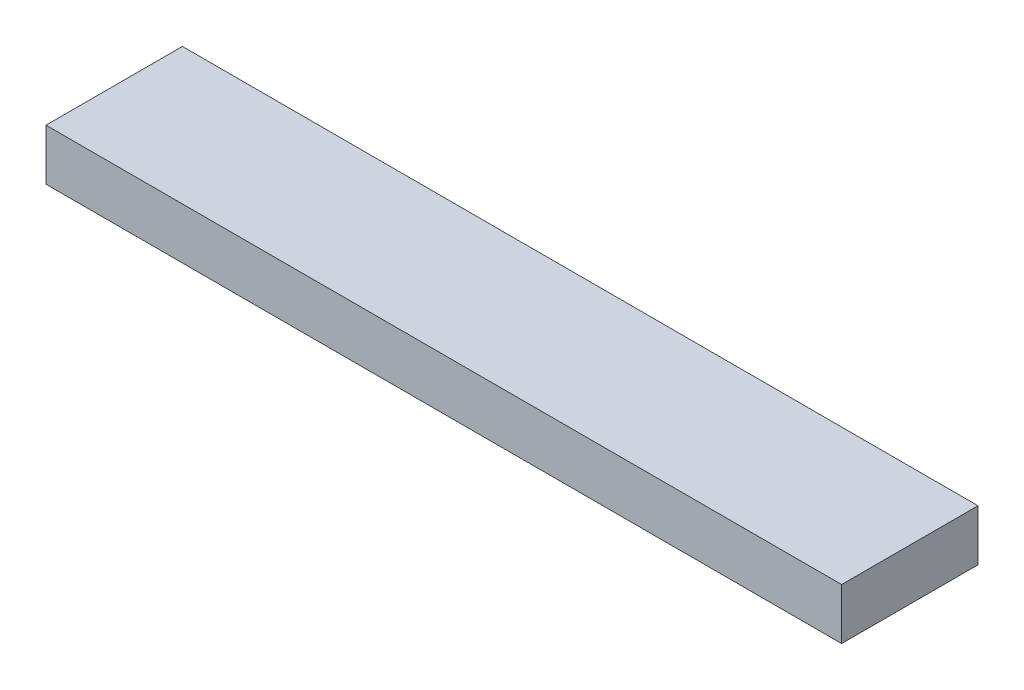
ISO-10303-21;
HEADER;
FILE_DESCRIPTION(('STEP AP214'),'2;1');
FILE_NAME('part.step','',(''),(''),'','','');
FILE_SCHEMA(('AUTOMOTIVE_DESIGN { 1 0 10303 214 1 1 1 1 }'));
ENDSEC;
DATA;
#1=APPLICATION_CONTEXT('core data for automotive mechanical design processes');
#2=APPLICATION_PROTOCOL_DEFINITION('international standard','automotive_design',2000,#1);
#3=PRODUCT_CONTEXT('',#1,'mechanical');
#4=PRODUCT('Part','Part','',(#3));
#5=PRODUCT_RELATED_PRODUCT_CATEGORY('part','',(#4));
#6=PRODUCT_DEFINITION_FORMATION('','',#4);
#7=PRODUCT_DEFINITION_CONTEXT('part definition',#1,'design');
#8=PRODUCT_DEFINITION('design','',#6,#7);
#9=PRODUCT_DEFINITION_SHAPE('','',#8);
#10=(LENGTH_UNIT() NAMED_UNIT(*) SI_UNIT(.MILLI.,.METRE.));
#11=(NAMED_UNIT(*) PLANE_ANGLE_UNIT() SI_UNIT($,.RADIAN.));
#12=(NAMED_UNIT(*) SI_UNIT($,.STERADIAN.) SOLID_ANGLE_UNIT());
#13=UNCERTAINTY_MEASURE_WITH_UNIT(LENGTH_MEASURE(1.E-05),#10,'distance_accuracy_value','');
#14=(GEOMETRIC_REPRESENTATION_CONTEXT(3) GLOBAL_UNCERTAINTY_ASSIGNED_CONTEXT((#13)) GLOBAL_UNIT_ASSIGNED_CONTEXT((#10,
#11,#12)) REPRESENTATION_CONTEXT('',''));
#15=CARTESIAN_POINT('',(0.,0.,0.));
#16=DIRECTION('',(0.,0.,1.));
#17=DIRECTION('',(1.,0.,0.));
#18=AXIS2_PLACEMENT_3D('',#15,#16,#17);
#19=CARTESIAN_POINT('',(0.,4.5,0.));
#20=DIRECTION('',(1.,0.,0.));
#21=DIRECTION('',(0.,0.,-1.));
#22=AXIS2_PLACEMENT_3D('',#19,#20,#21);
#23=PLANE('',#22);
#24=DIRECTION('',(0.,0.,1.));
#25=VECTOR('',#24,1.);
#26=CARTESIAN_POINT('',(0.,0.,0.));
#27=LINE('',#26,#25);
#28=CARTESIAN_POINT('',(0.,0.,-12.));
#29=VERTEX_POINT('',#28);
#30=CARTESIAN_POINT('',(0.,0.,0.));
#31=VERTEX_POINT('',#30);
#32=EDGE_CURVE('E98',#29,#31,#27,.T.);
#33=ORIENTED_EDGE('',*,*,#32,.T.);
#34=DIRECTION('',(0.,-1.,0.));
#35=VECTOR('',#34,1.);
#36=CARTESIAN_POINT('',(0.,4.5,0.));
#37=LINE('',#36,#35);
#38=CARTESIAN_POINT('',(0.,4.5,0.));
#39=VERTEX_POINT('',#38);
#40=EDGE_CURVE('E11',#39,#31,#37,.T.);
#41=ORIENTED_EDGE('',*,*,#40,.F.);
#42=DIRECTION('',(0.,0.,1.));
#43=VECTOR('',#42,1.);
#44=CARTESIAN_POINT('',(0.,4.5,0.));
#45=LINE('',#44,#43);
#46=CARTESIAN_POINT('',(0.,4.5,-12.));
#47=VERTEX_POINT('',#46);
#48=EDGE_CURVE('E86',#47,#39,#45,.T.);
#49=ORIENTED_EDGE('',*,*,#48,.F.);
#50=DIRECTION('',(0.,-1.,0.));
#51=VECTOR('',#50,1.);
#52=CARTESIAN_POINT('',(0.,4.5,-12.));
#53=LINE('',#52,#51);
#54=EDGE_CURVE('E94',#47,#29,#53,.T.);
#55=ORIENTED_EDGE('',*,*,#54,.T.);
#56=EDGE_LOOP('',(#33,#41,#49,#55));
#57=FACE_BOUND('',#56,.T.);
#58=ADVANCED_FACE('F35',(#57),#23,.F.);
#59=CARTESIAN_POINT('',(0.,4.5,0.));
#60=DIRECTION('',(0.,0.,-1.));
#61=DIRECTION('',(-1.,0.,0.));
#62=AXIS2_PLACEMENT_3D('',#59,#60,#61);
#63=PLANE('',#62);
#64=DIRECTION('',(1.,0.,0.));
#65=VECTOR('',#64,1.);
#66=CARTESIAN_POINT('',(0.,0.,0.));
#67=LINE('',#66,#65);
#68=CARTESIAN_POINT('',(70.,0.,0.));
#69=VERTEX_POINT('',#68);
#70=EDGE_CURVE('E90',#31,#69,#67,.T.);
#71=ORIENTED_EDGE('',*,*,#70,.T.);
#72=DIRECTION('',(0.,-1.,0.));
#73=VECTOR('',#72,1.);
#74=CARTESIAN_POINT('',(70.,4.5,0.));
#75=LINE('',#74,#73);
#76=CARTESIAN_POINT('',(70.,4.5,0.));
#77=VERTEX_POINT('',#76);
#78=EDGE_CURVE('E43',#77,#69,#75,.T.);
#79=ORIENTED_EDGE('',*,*,#78,.F.);
#80=DIRECTION('',(1.,0.,0.));
#81=VECTOR('',#80,1.);
#82=CARTESIAN_POINT('',(0.,4.5,0.));
#83=LINE('',#82,#81);
#84=EDGE_CURVE('E81',#39,#77,#83,.T.);
#85=ORIENTED_EDGE('',*,*,#84,.F.);
#86=ORIENTED_EDGE('',*,*,#40,.T.);
#87=EDGE_LOOP('',(#71,#79,#85,#86));
#88=FACE_BOUND('',#87,.T.);
#89=ADVANCED_FACE('F89',(#88),#63,.F.);
#90=CARTESIAN_POINT('',(70.,4.5,0.));
#91=DIRECTION('',(-1.,0.,0.));
#92=DIRECTION('',(0.,0.,1.));
#93=AXIS2_PLACEMENT_3D('',#90,#91,#92);
#94=PLANE('',#93);
#95=DIRECTION('',(0.,0.,-1.));
#96=VECTOR('',#95,1.);
#97=CARTESIAN_POINT('',(70.,0.,0.));
#98=LINE('',#97,#96);
#99=CARTESIAN_POINT('',(70.,0.,-12.));
#100=VERTEX_POINT('',#99);
#101=EDGE_CURVE('E68',#69,#100,#98,.T.);
#102=ORIENTED_EDGE('',*,*,#101,.T.);
#103=DIRECTION('',(0.,-1.,0.));
#104=VECTOR('',#103,1.);
#105=CARTESIAN_POINT('',(70.,4.5,-12.));
#106=LINE('',#105,#104);
#107=CARTESIAN_POINT('',(70.,4.5,-12.));
#108=VERTEX_POINT('',#107);
#109=EDGE_CURVE('E91',#108,#100,#106,.T.);
#110=ORIENTED_EDGE('',*,*,#109,.F.);
#111=DIRECTION('',(0.,0.,-1.));
#112=VECTOR('',#111,1.);
#113=CARTESIAN_POINT('',(70.,4.5,0.));
#114=LINE('',#113,#112);
#115=EDGE_CURVE('E84',#77,#108,#114,.T.);
#116=ORIENTED_EDGE('',*,*,#115,.F.);
#117=ORIENTED_EDGE('',*,*,#78,.T.);
#118=EDGE_LOOP('',(#102,#110,#116,#117));
#119=FACE_BOUND('',#118,.T.);
#120=ADVANCED_FACE('F92',(#119),#94,.F.);
#121=CARTESIAN_POINT('',(0.,4.5,-12.));
#122=DIRECTION('',(0.,0.,1.));
#123=DIRECTION('',(1.,0.,0.));
#124=AXIS2_PLACEMENT_3D('',#121,#122,#123);
#125=PLANE('',#124);
#126=DIRECTION('',(-1.,0.,0.));
#127=VECTOR('',#126,1.);
#128=CARTESIAN_POINT('',(0.,0.,-12.));
#129=LINE('',#128,#127);
#130=EDGE_CURVE('E74',#100,#29,#129,.T.);
#131=ORIENTED_EDGE('',*,*,#130,.T.);
#132=ORIENTED_EDGE('',*,*,#54,.F.);
#133=DIRECTION('',(-1.,0.,0.));
#134=VECTOR('',#133,1.);
#135=CARTESIAN_POINT('',(0.,4.5,-12.));
#136=LINE('',#135,#134);
#137=EDGE_CURVE('E51',#108,#47,#136,.T.);
#138=ORIENTED_EDGE('',*,*,#137,.F.);
#139=ORIENTED_EDGE('',*,*,#109,.T.);
#140=EDGE_LOOP('',(#131,#132,#138,#139));
#141=FACE_BOUND('',#140,.T.);
#142=ADVANCED_FACE('F105',(#141),#125,.F.);
#143=CARTESIAN_POINT('',(0.,4.5,0.));
#144=DIRECTION('',(0.,-1.,0.));
#145=DIRECTION('',(0.,0.,-1.));
#146=AXIS2_PLACEMENT_3D('',#143,#144,#145);
#147=PLANE('',#146);
#148=ORIENTED_EDGE('',*,*,#48,.T.);
#149=ORIENTED_EDGE('',*,*,#84,.T.);
#150=ORIENTED_EDGE('',*,*,#115,.T.);
#151=ORIENTED_EDGE('',*,*,#137,.T.);
#152=EDGE_LOOP('',(#148,#149,#150,#151));
#153=FACE_BOUND('',#152,.T.);
#154=ADVANCED_FACE('F82',(#153),#147,.F.);
#155=CARTESIAN_POINT('',(0.,0.,0.));
#156=DIRECTION('',(0.,-1.,0.));
#157=DIRECTION('',(0.,0.,-1.));
#158=AXIS2_PLACEMENT_3D('',#155,#156,#157);
#159=PLANE('',#158);
#160=ORIENTED_EDGE('',*,*,#32,.F.);
#161=ORIENTED_EDGE('',*,*,#130,.F.);
#162=ORIENTED_EDGE('',*,*,#101,.F.);
#163=ORIENTED_EDGE('',*,*,#70,.F.);
#164=EDGE_LOOP('',(#160,#161,#162,#163));
#165=FACE_BOUND('',#164,.T.);
#166=ADVANCED_FACE('F108',(#165),#159,.T.);
#167=CLOSED_SHELL('',(#58,#89,#120,#142,#154,#166));
#168=MANIFOLD_SOLID_BREP('B2',#167);
#169=ADVANCED_BREP_SHAPE_REPRESENTATION('',(#18,#168),#14);
#170=SHAPE_DEFINITION_REPRESENTATION(#9,#169);
ENDSEC;
END-ISO-10303-21;
